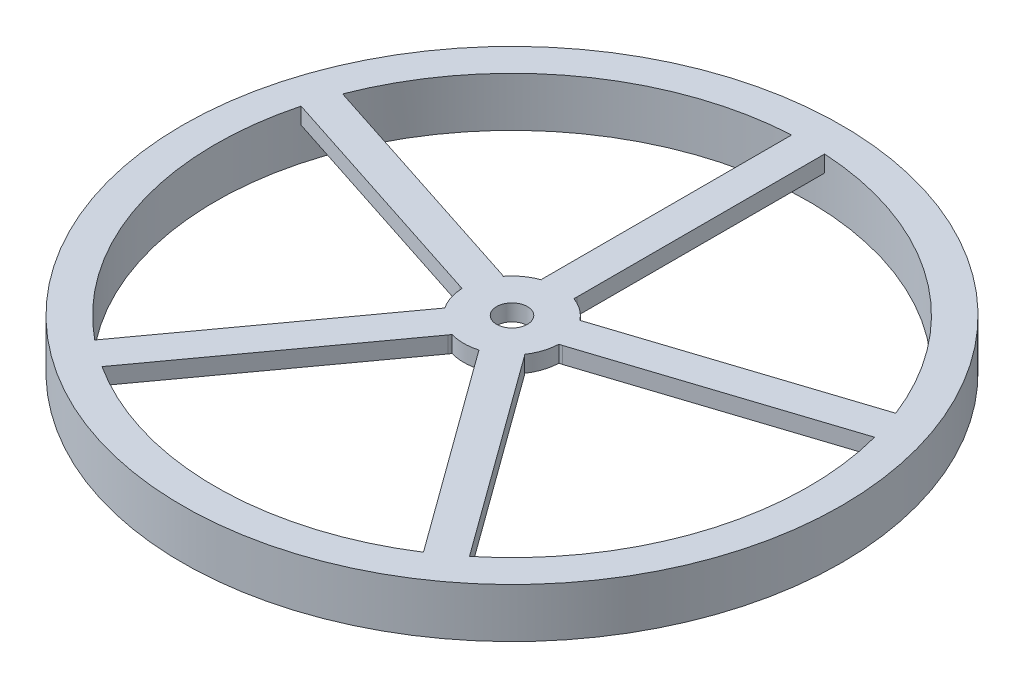
ISO-10303-21;
HEADER;
FILE_DESCRIPTION(('STEP AP214'),'2;1');
FILE_NAME('part.step','',(''),(''),'','','');
FILE_SCHEMA(('AUTOMOTIVE_DESIGN { 1 0 10303 214 1 1 1 1 }'));
ENDSEC;
DATA;
#1=APPLICATION_CONTEXT('core data for automotive mechanical design processes');
#2=APPLICATION_PROTOCOL_DEFINITION('international standard','automotive_design',2000,#1);
#3=PRODUCT_CONTEXT('',#1,'mechanical');
#4=PRODUCT('Part','Part','',(#3));
#5=PRODUCT_RELATED_PRODUCT_CATEGORY('part','',(#4));
#6=PRODUCT_DEFINITION_FORMATION('','',#4);
#7=PRODUCT_DEFINITION_CONTEXT('part definition',#1,'design');
#8=PRODUCT_DEFINITION('design','',#6,#7);
#9=PRODUCT_DEFINITION_SHAPE('','',#8);
#10=(LENGTH_UNIT() NAMED_UNIT(*) SI_UNIT(.MILLI.,.METRE.));
#11=(NAMED_UNIT(*) PLANE_ANGLE_UNIT() SI_UNIT($,.RADIAN.));
#12=(NAMED_UNIT(*) SI_UNIT($,.STERADIAN.) SOLID_ANGLE_UNIT());
#13=UNCERTAINTY_MEASURE_WITH_UNIT(LENGTH_MEASURE(1.E-05),#10,'distance_accuracy_value','');
#14=(GEOMETRIC_REPRESENTATION_CONTEXT(3) GLOBAL_UNCERTAINTY_ASSIGNED_CONTEXT((#13)) GLOBAL_UNIT_ASSIGNED_CONTEXT((#10,
#11,#12)) REPRESENTATION_CONTEXT('',''));
#15=CARTESIAN_POINT('',(0.,0.,0.));
#16=DIRECTION('',(0.,0.,1.));
#17=DIRECTION('',(1.,0.,0.));
#18=AXIS2_PLACEMENT_3D('',#15,#16,#17);
#19=CARTESIAN_POINT('',(0.,19.2418630451792,0.));
#20=DIRECTION('',(0.,1.,0.));
#21=DIRECTION('',(0.,0.,1.));
#22=AXIS2_PLACEMENT_3D('',#19,#20,#21);
#23=CYLINDRICAL_SURFACE('',#22,22.0125);
#24=DIRECTION('',(0.,1.,0.));
#25=VECTOR('',#24,1.);
#26=CARTESIAN_POINT('',(17.4362336668345,22.9918630451792,-13.4360675707421));
#27=LINE('',#26,#25);
#28=CARTESIAN_POINT('',(17.4362336668345,19.2418630451792,-13.4360675707421));
#29=VERTEX_POINT('',#28);
#30=CARTESIAN_POINT('',(17.4362336668345,26.7418630451792,-13.4360675707421));
#31=VERTEX_POINT('',#30);
#32=EDGE_CURVE('E296',#29,#31,#27,.T.);
#33=ORIENTED_EDGE('',*,*,#32,.F.);
#34=CARTESIAN_POINT('',(0.,19.2418630451792,0.));
#35=DIRECTION('',(0.,1.,0.));
#36=DIRECTION('',(1.,0.,0.));
#37=AXIS2_PLACEMENT_3D('',#34,#35,#36);
#38=CIRCLE('',#37,22.0125);
#39=CARTESIAN_POINT('',(7.39036709559162,19.2418630451792,-20.7348168654174));
#40=VERTEX_POINT('',#39);
#41=EDGE_CURVE('E422',#29,#40,#38,.T.);
#42=ORIENTED_EDGE('',*,*,#41,.T.);
#43=DIRECTION('',(0.,1.,0.));
#44=VECTOR('',#43,1.);
#45=CARTESIAN_POINT('',(7.39036709559161,22.9918630451792,-20.7348168654174));
#46=LINE('',#45,#44);
#47=CARTESIAN_POINT('',(7.39036709559161,26.7418630451792,-20.7348168654174));
#48=VERTEX_POINT('',#47);
#49=EDGE_CURVE('E491',#40,#48,#46,.T.);
#50=ORIENTED_EDGE('',*,*,#49,.T.);
#51=CARTESIAN_POINT('',(0.,26.7418630451792,0.));
#52=DIRECTION('',(0.,1.,0.));
#53=DIRECTION('',(1.,0.,0.));
#54=AXIS2_PLACEMENT_3D('',#51,#52,#53);
#55=CIRCLE('',#54,22.0125);
#56=EDGE_CURVE('E412',#31,#48,#55,.T.);
#57=ORIENTED_EDGE('',*,*,#56,.F.);
#58=EDGE_LOOP('',(#33,#42,#50,#57));
#59=FACE_BOUND('',#58,.T.);
#60=ADVANCED_FACE('F51',(#59),#23,.T.);
#61=DIRECTION('',(0.,1.,0.));
#62=VECTOR('',#61,1.);
#63=CARTESIAN_POINT('',(22.0037317212491,22.9918630451792,0.62124599740919));
#64=LINE('',#63,#62);
#65=CARTESIAN_POINT('',(22.0037317212491,26.7418630451792,0.62124599740919));
#66=VERTEX_POINT('',#65);
#67=CARTESIAN_POINT('',(22.0037317212491,19.2418630451792,0.62124599740919));
#68=VERTEX_POINT('',#67);
#69=EDGE_CURVE('E254',#66,#68,#64,.F.);
#70=ORIENTED_EDGE('',*,*,#69,.F.);
#71=CARTESIAN_POINT('',(18.1665521374807,26.7418630451792,12.4308704315585));
#72=VERTEX_POINT('',#71);
#73=EDGE_CURVE('E543',#72,#66,#55,.T.);
#74=ORIENTED_EDGE('',*,*,#73,.F.);
#75=DIRECTION('',(0.,1.,0.));
#76=VECTOR('',#75,1.);
#77=CARTESIAN_POINT('',(18.1665521374807,22.9918630451792,12.4308704315585));
#78=LINE('',#77,#76);
#79=CARTESIAN_POINT('',(18.1665521374807,19.2418630451792,12.4308704315585));
#80=VERTEX_POINT('',#79);
#81=EDGE_CURVE('E332',#80,#72,#78,.T.);
#82=ORIENTED_EDGE('',*,*,#81,.F.);
#83=EDGE_CURVE('E548',#80,#68,#38,.T.);
#84=ORIENTED_EDGE('',*,*,#83,.T.);
#85=EDGE_LOOP('',(#70,#74,#82,#84));
#86=FACE_BOUND('',#85,.T.);
#87=ADVANCED_FACE('F546',(#86),#23,.T.);
#88=DIRECTION('',(0.,1.,0.));
#89=VECTOR('',#88,1.);
#90=CARTESIAN_POINT('',(6.20868698747474,22.9918630451792,21.1187680071912));
#91=LINE('',#90,#89);
#92=CARTESIAN_POINT('',(6.20868698747474,26.7418630451792,21.1187680071912));
#93=VERTEX_POINT('',#92);
#94=CARTESIAN_POINT('',(6.20868698747474,19.2418630451792,21.1187680071912));
#95=VERTEX_POINT('',#94);
#96=EDGE_CURVE('E326',#93,#95,#91,.F.);
#97=ORIENTED_EDGE('',*,*,#96,.F.);
#98=CARTESIAN_POINT('',(-6.20868698747442,26.7418630451792,21.1187680071913));
#99=VERTEX_POINT('',#98);
#100=EDGE_CURVE('E591',#99,#93,#55,.T.);
#101=ORIENTED_EDGE('',*,*,#100,.F.);
#102=DIRECTION('',(0.,1.,0.));
#103=VECTOR('',#102,1.);
#104=CARTESIAN_POINT('',(-6.20868698747442,22.9918630451792,21.1187680071913));
#105=LINE('',#104,#103);
#106=CARTESIAN_POINT('',(-6.20868698747442,19.2418630451792,21.1187680071913));
#107=VERTEX_POINT('',#106);
#108=EDGE_CURVE('E369',#107,#99,#105,.T.);
#109=ORIENTED_EDGE('',*,*,#108,.F.);
#110=EDGE_CURVE('E551',#107,#95,#38,.T.);
#111=ORIENTED_EDGE('',*,*,#110,.T.);
#112=EDGE_LOOP('',(#97,#101,#109,#111));
#113=FACE_BOUND('',#112,.T.);
#114=ADVANCED_FACE('F631',(#113),#23,.T.);
#115=DIRECTION('',(0.,1.,0.));
#116=VECTOR('',#115,1.);
#117=CARTESIAN_POINT('',(-18.1665521374805,22.9918630451792,12.4308704315587));
#118=LINE('',#117,#116);
#119=CARTESIAN_POINT('',(-18.1665521374805,26.7418630451792,12.4308704315587));
#120=VERTEX_POINT('',#119);
#121=CARTESIAN_POINT('',(-18.1665521374805,19.2418630451792,12.4308704315587));
#122=VERTEX_POINT('',#121);
#123=EDGE_CURVE('E363',#120,#122,#118,.F.);
#124=ORIENTED_EDGE('',*,*,#123,.F.);
#125=CARTESIAN_POINT('',(-22.0037317212491,26.7418630451792,0.621245997409502));
#126=VERTEX_POINT('',#125);
#127=EDGE_CURVE('E427',#126,#120,#55,.T.);
#128=ORIENTED_EDGE('',*,*,#127,.F.);
#129=DIRECTION('',(0.,1.,0.));
#130=VECTOR('',#129,1.);
#131=CARTESIAN_POINT('',(-22.0037317212491,22.9918630451792,0.621245997409502));
#132=LINE('',#131,#130);
#133=CARTESIAN_POINT('',(-22.0037317212491,19.2418630451792,0.621245997409502));
#134=VERTEX_POINT('',#133);
#135=EDGE_CURVE('E498',#134,#126,#132,.T.);
#136=ORIENTED_EDGE('',*,*,#135,.F.);
#137=EDGE_CURVE('E421',#134,#122,#38,.T.);
#138=ORIENTED_EDGE('',*,*,#137,.T.);
#139=EDGE_LOOP('',(#124,#128,#136,#138));
#140=FACE_BOUND('',#139,.T.);
#141=ADVANCED_FACE('F574',(#140),#23,.T.);
#142=CARTESIAN_POINT('',(0.,19.2418630451792,-22.0125));
#143=DIRECTION('',(0.,1.,0.));
#144=DIRECTION('',(0.,0.,1.));
#145=AXIS2_PLACEMENT_3D('',#142,#143,#144);
#146=CYLINDRICAL_SURFACE('',#145,7.5);
#147=ORIENTED_EDGE('',*,*,#49,.F.);
#148=CARTESIAN_POINT('',(0.,19.2418630451792,-22.0125));
#149=DIRECTION('',(0.,1.,0.));
#150=DIRECTION('',(0.,0.,-1.));
#151=AXIS2_PLACEMENT_3D('',#148,#149,#150);
#152=CIRCLE('',#151,7.5);
#153=CARTESIAN_POINT('',(7.50000000000001,19.2418630451792,-22.0125));
#154=VERTEX_POINT('',#153);
#155=EDGE_CURVE('E433',#40,#154,#152,.T.);
#156=ORIENTED_EDGE('',*,*,#155,.T.);
#157=DIRECTION('',(0.,1.,0.));
#158=VECTOR('',#157,1.);
#159=CARTESIAN_POINT('',(7.50000000000001,19.2418630451792,-22.0125));
#160=LINE('',#159,#158);
#161=CARTESIAN_POINT('',(7.50000000000001,26.7418630451792,-22.0125));
#162=VERTEX_POINT('',#161);
#163=EDGE_CURVE('E440',#154,#162,#160,.T.);
#164=ORIENTED_EDGE('',*,*,#163,.T.);
#165=CARTESIAN_POINT('',(0.,26.7418630451792,-22.0125));
#166=DIRECTION('',(0.,1.,0.));
#167=DIRECTION('',(0.,0.,-1.));
#168=AXIS2_PLACEMENT_3D('',#165,#166,#167);
#169=CIRCLE('',#168,7.5);
#170=EDGE_CURVE('E420',#48,#162,#169,.T.);
#171=ORIENTED_EDGE('',*,*,#170,.F.);
#172=EDGE_LOOP('',(#147,#156,#164,#171));
#173=FACE_BOUND('',#172,.T.);
#174=ADVANCED_FACE('F563',(#173),#146,.T.);
#175=CARTESIAN_POINT('',(0.,26.7418630451792,0.));
#176=DIRECTION('',(0.,1.,0.));
#177=DIRECTION('',(0.,0.,1.));
#178=AXIS2_PLACEMENT_3D('',#175,#176,#177);
#179=PLANE('',#178);
#180=CARTESIAN_POINT('',(20.935131564947,26.7418630451792,-6.80223658867877));
#181=DIRECTION('',(0.,1.,0.));
#182=DIRECTION('',(0.95105651629515,0.,-0.309016994374958));
#183=AXIS2_PLACEMENT_3D('',#180,#181,#182);
#184=CIRCLE('',#183,7.5);
#185=CARTESIAN_POINT('',(18.6175041071348,26.7418630451792,-13.9351604608924));
#186=VERTEX_POINT('',#185);
#187=EDGE_CURVE('E67',#186,#31,#184,.T.);
#188=ORIENTED_EDGE('',*,*,#187,.T.);
#189=ORIENTED_EDGE('',*,*,#56,.T.);
#190=ORIENTED_EDGE('',*,*,#170,.T.);
#191=DIRECTION('',(0.,0.,-1.));
#192=VECTOR('',#191,1.);
#193=CARTESIAN_POINT('',(7.50000000000001,26.7418630451792,-22.0125));
#194=LINE('',#193,#192);
#195=CARTESIAN_POINT('',(7.50000000000001,26.7418630451792,-134.791505667086));
#196=VERTEX_POINT('',#195);
#197=EDGE_CURVE('E445',#162,#196,#194,.T.);
#198=ORIENTED_EDGE('',*,*,#197,.T.);
#199=CARTESIAN_POINT('',(0.,26.7418630451792,0.));
#200=DIRECTION('',(0.,1.,0.));
#201=DIRECTION('',(0.,0.,1.));
#202=AXIS2_PLACEMENT_3D('',#199,#200,#201);
#203=CIRCLE('',#202,135.);
#204=CARTESIAN_POINT('',(125.876712348104,26.7418630451792,-48.7857898207316));
#205=VERTEX_POINT('',#204);
#206=EDGE_CURVE('E465',#205,#196,#203,.T.);
#207=ORIENTED_EDGE('',*,*,#206,.F.);
#208=DIRECTION('',(-0.95105651629515,0.,0.309016994374958));
#209=VECTOR('',#208,1.);
#210=CARTESIAN_POINT('',(18.6175041071348,26.7418630451792,-13.9351604608924));
#211=LINE('',#210,#209);
#212=EDGE_CURVE('E261',#205,#186,#211,.T.);
#213=ORIENTED_EDGE('',*,*,#212,.T.);
#214=EDGE_LOOP('',(#188,#189,#190,#198,#207,#213));
#215=FACE_BOUND('',#214,.T.);
#216=ORIENTED_EDGE('',*,*,#73,.T.);
#217=CARTESIAN_POINT('',(23.2527590227592,26.7418630451792,0.330687283534859));
#218=VERTEX_POINT('',#217);
#219=EDGE_CURVE('E286',#66,#218,#184,.T.);
#220=ORIENTED_EDGE('',*,*,#219,.T.);
#221=DIRECTION('',(0.95105651629515,0.,-0.309016994374958));
#222=VECTOR('',#221,1.);
#223=CARTESIAN_POINT('',(23.2527590227592,26.7418630451792,0.330687283534859));
#224=LINE('',#223,#222);
#225=CARTESIAN_POINT('',(130.511967263729,26.7418630451792,-34.5199420763043));
#226=VERTEX_POINT('',#225);
#227=EDGE_CURVE('E268',#218,#226,#224,.T.);
#228=ORIENTED_EDGE('',*,*,#227,.T.);
#229=CARTESIAN_POINT('',(85.2960866232233,26.7418630451792,104.640229389865));
#230=VERTEX_POINT('',#229);
#231=EDGE_CURVE('E540',#230,#226,#203,.T.);
#232=ORIENTED_EDGE('',*,*,#231,.F.);
#233=DIRECTION('',(-0.58778525229248,0.,-0.809016994374942));
#234=VECTOR('',#233,1.);
#235=CARTESIAN_POINT('',(19.0062503239003,26.7418630451792,13.4000971964848));
#236=LINE('',#235,#234);
#237=CARTESIAN_POINT('',(19.0062503239003,26.7418630451792,13.4000971964848));
#238=VERTEX_POINT('',#237);
#239=EDGE_CURVE('E319',#230,#238,#236,.T.);
#240=ORIENTED_EDGE('',*,*,#239,.T.);
#241=CARTESIAN_POINT('',(12.9386228660882,26.7418630451792,17.8084865886784));
#242=DIRECTION('',(0.,1.,0.));
#243=DIRECTION('',(0.58778525229248,0.,0.809016994374942));
#244=AXIS2_PLACEMENT_3D('',#241,#242,#243);
#245=CIRCLE('',#244,7.5);
#246=EDGE_CURVE('E312',#238,#72,#245,.T.);
#247=ORIENTED_EDGE('',*,*,#246,.T.);
#248=EDGE_LOOP('',(#216,#220,#228,#232,#240,#247));
#249=FACE_BOUND('',#248,.T.);
#250=ORIENTED_EDGE('',*,*,#100,.T.);
#251=CARTESIAN_POINT('',(6.87099540827616,26.7418630451792,22.216875980872));
#252=VERTEX_POINT('',#251);
#253=EDGE_CURVE('E299',#93,#252,#245,.T.);
#254=ORIENTED_EDGE('',*,*,#253,.T.);
#255=DIRECTION('',(0.58778525229248,0.,0.809016994374942));
#256=VECTOR('',#255,1.);
#257=CARTESIAN_POINT('',(6.87099540827616,26.7418630451792,22.216875980872));
#258=LINE('',#257,#256);
#259=CARTESIAN_POINT('',(73.1608317075992,26.7418630451792,113.457008174252));
#260=VERTEX_POINT('',#259);
#261=EDGE_CURVE('E315',#252,#260,#258,.T.);
#262=ORIENTED_EDGE('',*,*,#261,.T.);
#263=CARTESIAN_POINT('',(-73.1608317075975,26.7418630451792,113.457008174253));
#264=VERTEX_POINT('',#263);
#265=EDGE_CURVE('E604',#264,#260,#203,.T.);
#266=ORIENTED_EDGE('',*,*,#265,.F.);
#267=DIRECTION('',(0.587785252292469,0.,-0.809016994374951));
#268=VECTOR('',#267,1.);
#269=CARTESIAN_POINT('',(-6.87099540827583,26.7418630451792,22.2168759808721));
#270=LINE('',#269,#268);
#271=CARTESIAN_POINT('',(-6.87099540827583,26.7418630451792,22.2168759808721));
#272=VERTEX_POINT('',#271);
#273=EDGE_CURVE('E356',#264,#272,#270,.T.);
#274=ORIENTED_EDGE('',*,*,#273,.T.);
#275=CARTESIAN_POINT('',(-12.938622866088,26.7418630451792,17.8084865886786));
#276=DIRECTION('',(0.,1.,0.));
#277=DIRECTION('',(-0.587785252292469,0.,0.809016994374951));
#278=AXIS2_PLACEMENT_3D('',#275,#276,#277);
#279=CIRCLE('',#278,7.5);
#280=EDGE_CURVE('E349',#272,#99,#279,.T.);
#281=ORIENTED_EDGE('',*,*,#280,.T.);
#282=EDGE_LOOP('',(#250,#254,#262,#266,#274,#281));
#283=FACE_BOUND('',#282,.T.);
#284=ORIENTED_EDGE('',*,*,#127,.T.);
#285=CARTESIAN_POINT('',(-19.0062503239001,26.7418630451792,13.4000971964851));
#286=VERTEX_POINT('',#285);
#287=EDGE_CURVE('E336',#120,#286,#279,.T.);
#288=ORIENTED_EDGE('',*,*,#287,.T.);
#289=DIRECTION('',(-0.587785252292469,0.,0.809016994374951));
#290=VECTOR('',#289,1.);
#291=CARTESIAN_POINT('',(-19.0062503239001,26.7418630451792,13.4000971964851));
#292=LINE('',#291,#290);
#293=CARTESIAN_POINT('',(-85.2960866232218,26.7418630451792,104.640229389866));
#294=VERTEX_POINT('',#293);
#295=EDGE_CURVE('E352',#286,#294,#292,.T.);
#296=ORIENTED_EDGE('',*,*,#295,.T.);
#297=CARTESIAN_POINT('',(-130.511967263729,26.7418630451792,-34.5199420763025));
#298=VERTEX_POINT('',#297);
#299=EDGE_CURVE('E464',#298,#294,#203,.T.);
#300=ORIENTED_EDGE('',*,*,#299,.F.);
#301=DIRECTION('',(0.951056516295155,0.,0.309016994374945));
#302=VECTOR('',#301,1.);
#303=CARTESIAN_POINT('',(-23.2527590227592,26.7418630451792,0.330687283535189));
#304=LINE('',#303,#302);
#305=CARTESIAN_POINT('',(-23.2527590227592,26.7418630451792,0.330687283535189));
#306=VERTEX_POINT('',#305);
#307=EDGE_CURVE('E393',#298,#306,#304,.T.);
#308=ORIENTED_EDGE('',*,*,#307,.T.);
#309=CARTESIAN_POINT('',(-20.9351315649471,26.7418630451792,-6.80223658867847));
#310=DIRECTION('',(0.,1.,0.));
#311=DIRECTION('',(-0.951056516295155,0.,-0.309016994374945));
#312=AXIS2_PLACEMENT_3D('',#309,#310,#311);
#313=CIRCLE('',#312,7.5);
#314=EDGE_CURVE('E386',#306,#126,#313,.T.);
#315=ORIENTED_EDGE('',*,*,#314,.T.);
#316=EDGE_LOOP('',(#284,#288,#296,#300,#308,#315));
#317=FACE_BOUND('',#316,.T.);
#318=CARTESIAN_POINT('',(-7.3903670955916,26.7418630451792,-20.7348168654174));
#319=VERTEX_POINT('',#318);
#320=CARTESIAN_POINT('',(-17.4362336668346,26.7418630451792,-13.4360675707419));
#321=VERTEX_POINT('',#320);
#322=EDGE_CURVE('E423',#319,#321,#55,.T.);
#323=ORIENTED_EDGE('',*,*,#322,.T.);
#324=CARTESIAN_POINT('',(-18.617504107135,26.7418630451792,-13.9351604608921));
#325=VERTEX_POINT('',#324);
#326=EDGE_CURVE('E373',#321,#325,#313,.T.);
#327=ORIENTED_EDGE('',*,*,#326,.T.);
#328=DIRECTION('',(-0.951056516295155,0.,-0.309016994374945));
#329=VECTOR('',#328,1.);
#330=CARTESIAN_POINT('',(-18.617504107135,26.7418630451792,-13.9351604608921));
#331=LINE('',#330,#329);
#332=CARTESIAN_POINT('',(-125.876712348105,26.7418630451792,-48.7857898207298));
#333=VERTEX_POINT('',#332);
#334=EDGE_CURVE('E389',#325,#333,#331,.T.);
#335=ORIENTED_EDGE('',*,*,#334,.T.);
#336=CARTESIAN_POINT('',(-7.49999999999999,26.7418630451792,-134.791505667086));
#337=VERTEX_POINT('',#336);
#338=EDGE_CURVE('E460',#337,#333,#203,.T.);
#339=ORIENTED_EDGE('',*,*,#338,.F.);
#340=DIRECTION('',(0.,0.,1.));
#341=VECTOR('',#340,1.);
#342=CARTESIAN_POINT('',(-7.49999999999999,26.7418630451792,-22.0125));
#343=LINE('',#342,#341);
#344=CARTESIAN_POINT('',(-7.49999999999999,26.7418630451792,-22.0125));
#345=VERTEX_POINT('',#344);
#346=EDGE_CURVE('E449',#337,#345,#343,.T.);
#347=ORIENTED_EDGE('',*,*,#346,.T.);
#348=EDGE_CURVE('E441',#345,#319,#169,.T.);
#349=ORIENTED_EDGE('',*,*,#348,.T.);
#350=EDGE_LOOP('',(#323,#327,#335,#339,#347,#349));
#351=FACE_BOUND('',#350,.T.);
#352=CARTESIAN_POINT('',(0.,26.7418630451792,0.));
#353=DIRECTION('',(0.,1.,0.));
#354=DIRECTION('',(1.,0.,0.));
#355=AXIS2_PLACEMENT_3D('',#352,#353,#354);
#356=CIRCLE('',#355,150.);
#357=CARTESIAN_POINT('',(150.,26.7418630451792,0.));
#358=VERTEX_POINT('',#357);
#359=EDGE_CURVE('E469',#358,#358,#356,.T.);
#360=ORIENTED_EDGE('',*,*,#359,.T.);
#361=EDGE_LOOP('',(#360));
#362=FACE_BOUND('',#361,.T.);
#363=CARTESIAN_POINT('',(0.,26.7418630451792,0.));
#364=DIRECTION('',(0.,1.,0.));
#365=DIRECTION('',(0.,0.,1.));
#366=AXIS2_PLACEMENT_3D('',#363,#364,#365);
#367=CIRCLE('',#366,7.0125);
#368=CARTESIAN_POINT('',(0.,26.7418630451792,7.0125));
#369=VERTEX_POINT('',#368);
#370=EDGE_CURVE('E407',#369,#369,#367,.T.);
#371=ORIENTED_EDGE('',*,*,#370,.F.);
#372=EDGE_LOOP('',(#371));
#373=FACE_BOUND('',#372,.T.);
#374=ADVANCED_FACE('F538',(#215,#249,#283,#317,#351,#362,#373),#179,.T.);
#375=CARTESIAN_POINT('',(0.,4.24186304517918,0.));
#376=DIRECTION('',(0.,1.,0.));
#377=DIRECTION('',(0.,0.,1.));
#378=AXIS2_PLACEMENT_3D('',#375,#376,#377);
#379=PLANE('',#378);
#380=CARTESIAN_POINT('',(0.,4.24186304517918,0.));
#381=DIRECTION('',(0.,1.,0.));
#382=DIRECTION('',(1.,0.,0.));
#383=AXIS2_PLACEMENT_3D('',#380,#381,#382);
#384=CIRCLE('',#383,150.);
#385=CARTESIAN_POINT('',(150.,4.24186304517918,0.));
#386=VERTEX_POINT('',#385);
#387=EDGE_CURVE('E463',#386,#386,#384,.T.);
#388=ORIENTED_EDGE('',*,*,#387,.F.);
#389=EDGE_LOOP('',(#388));
#390=FACE_BOUND('',#389,.T.);
#391=CARTESIAN_POINT('',(0.,4.24186304517918,0.));
#392=DIRECTION('',(0.,1.,0.));
#393=DIRECTION('',(0.,0.,1.));
#394=AXIS2_PLACEMENT_3D('',#391,#392,#393);
#395=CIRCLE('',#394,135.);
#396=CARTESIAN_POINT('',(0.,4.24186304517918,135.));
#397=VERTEX_POINT('',#396);
#398=EDGE_CURVE('E456',#397,#397,#395,.T.);
#399=ORIENTED_EDGE('',*,*,#398,.T.);
#400=EDGE_LOOP('',(#399));
#401=FACE_BOUND('',#400,.T.);
#402=ADVANCED_FACE('F885',(#390,#401),#379,.F.);
#403=CARTESIAN_POINT('',(0.,26.7418630451792,0.));
#404=DIRECTION('',(0.,-1.,0.));
#405=DIRECTION('',(0.,0.,-1.));
#406=AXIS2_PLACEMENT_3D('',#403,#404,#405);
#407=CYLINDRICAL_SURFACE('',#406,150.);
#408=ORIENTED_EDGE('',*,*,#359,.F.);
#409=EDGE_LOOP('',(#408));
#410=FACE_BOUND('',#409,.T.);
#411=ORIENTED_EDGE('',*,*,#387,.T.);
#412=EDGE_LOOP('',(#411));
#413=FACE_BOUND('',#412,.T.);
#414=ADVANCED_FACE('F53',(#410,#413),#407,.T.);
#415=CARTESIAN_POINT('',(0.,26.7418630451792,0.));
#416=DIRECTION('',(0.,-1.,0.));
#417=DIRECTION('',(0.,0.,-1.));
#418=AXIS2_PLACEMENT_3D('',#415,#416,#417);
#419=CYLINDRICAL_SURFACE('',#418,135.);
#420=DIRECTION('',(0.,-1.,0.));
#421=VECTOR('',#420,1.);
#422=CARTESIAN_POINT('',(125.876712348104,26.7418630451792,-48.7857898207316));
#423=LINE('',#422,#421);
#424=CARTESIAN_POINT('',(125.876712348104,19.2418630451792,-48.7857898207316));
#425=VERTEX_POINT('',#424);
#426=EDGE_CURVE('E12',#205,#425,#423,.T.);
#427=ORIENTED_EDGE('',*,*,#426,.F.);
#428=ORIENTED_EDGE('',*,*,#206,.T.);
#429=DIRECTION('',(0.,-1.,0.));
#430=VECTOR('',#429,1.);
#431=CARTESIAN_POINT('',(7.50000000000001,26.7418630451792,-134.791505667086));
#432=LINE('',#431,#430);
#433=CARTESIAN_POINT('',(7.50000000000001,19.2418630451792,-134.791505667086));
#434=VERTEX_POINT('',#433);
#435=EDGE_CURVE('E480',#434,#196,#432,.F.);
#436=ORIENTED_EDGE('',*,*,#435,.F.);
#437=CARTESIAN_POINT('',(0.,19.2418630451792,0.));
#438=DIRECTION('',(0.,-1.,0.));
#439=DIRECTION('',(0.,0.,-1.));
#440=AXIS2_PLACEMENT_3D('',#437,#438,#439);
#441=CIRCLE('',#440,135.);
#442=CARTESIAN_POINT('',(-7.49999999999999,19.2418630451792,-134.791505667086));
#443=VERTEX_POINT('',#442);
#444=EDGE_CURVE('E473',#443,#434,#441,.T.);
#445=ORIENTED_EDGE('',*,*,#444,.F.);
#446=DIRECTION('',(0.,-1.,0.));
#447=VECTOR('',#446,1.);
#448=CARTESIAN_POINT('',(-7.49999999999999,26.7418630451792,-134.791505667086));
#449=LINE('',#448,#447);
#450=EDGE_CURVE('E484',#337,#443,#449,.T.);
#451=ORIENTED_EDGE('',*,*,#450,.F.);
#452=ORIENTED_EDGE('',*,*,#338,.T.);
#453=DIRECTION('',(0.,-1.,0.));
#454=VECTOR('',#453,1.);
#455=CARTESIAN_POINT('',(-125.876712348105,26.7418630451792,-48.7857898207298));
#456=LINE('',#455,#454);
#457=CARTESIAN_POINT('',(-125.876712348105,19.2418630451792,-48.7857898207298));
#458=VERTEX_POINT('',#457);
#459=EDGE_CURVE('E502',#458,#333,#456,.F.);
#460=ORIENTED_EDGE('',*,*,#459,.F.);
#461=CARTESIAN_POINT('',(0.,19.2418630451792,0.));
#462=DIRECTION('',(0.,-1.,0.));
#463=DIRECTION('',(0.,0.,-1.));
#464=AXIS2_PLACEMENT_3D('',#461,#462,#463);
#465=CIRCLE('',#464,135.);
#466=CARTESIAN_POINT('',(-130.511967263729,19.2418630451792,-34.5199420763025));
#467=VERTEX_POINT('',#466);
#468=EDGE_CURVE('E400',#467,#458,#465,.T.);
#469=ORIENTED_EDGE('',*,*,#468,.F.);
#470=DIRECTION('',(0.,-1.,0.));
#471=VECTOR('',#470,1.);
#472=CARTESIAN_POINT('',(-130.511967263729,26.7418630451792,-34.5199420763025));
#473=LINE('',#472,#471);
#474=EDGE_CURVE('E506',#298,#467,#473,.T.);
#475=ORIENTED_EDGE('',*,*,#474,.F.);
#476=ORIENTED_EDGE('',*,*,#299,.T.);
#477=DIRECTION('',(0.,-1.,0.));
#478=VECTOR('',#477,1.);
#479=CARTESIAN_POINT('',(-85.2960866232218,26.7418630451792,104.640229389866));
#480=LINE('',#479,#478);
#481=CARTESIAN_POINT('',(-85.2960866232218,19.2418630451792,104.640229389866));
#482=VERTEX_POINT('',#481);
#483=EDGE_CURVE('E514',#482,#294,#480,.F.);
#484=ORIENTED_EDGE('',*,*,#483,.F.);
#485=CARTESIAN_POINT('',(0.,19.2418630451792,0.));
#486=DIRECTION('',(0.,-1.,0.));
#487=DIRECTION('',(0.,0.,-1.));
#488=AXIS2_PLACEMENT_3D('',#485,#486,#487);
#489=CIRCLE('',#488,135.);
#490=CARTESIAN_POINT('',(-73.1608317075975,19.2418630451792,113.457008174253));
#491=VERTEX_POINT('',#490);
#492=EDGE_CURVE('E510',#491,#482,#489,.T.);
#493=ORIENTED_EDGE('',*,*,#492,.F.);
#494=DIRECTION('',(0.,-1.,0.));
#495=VECTOR('',#494,1.);
#496=CARTESIAN_POINT('',(-73.1608317075975,26.7418630451792,113.457008174253));
#497=LINE('',#496,#495);
#498=EDGE_CURVE('E518',#264,#491,#497,.T.);
#499=ORIENTED_EDGE('',*,*,#498,.F.);
#500=ORIENTED_EDGE('',*,*,#265,.T.);
#501=DIRECTION('',(0.,-1.,0.));
#502=VECTOR('',#501,1.);
#503=CARTESIAN_POINT('',(73.1608317075992,26.7418630451792,113.457008174252));
#504=LINE('',#503,#502);
#505=CARTESIAN_POINT('',(73.1608317075992,19.2418630451792,113.457008174252));
#506=VERTEX_POINT('',#505);
#507=EDGE_CURVE('E526',#506,#260,#504,.F.);
#508=ORIENTED_EDGE('',*,*,#507,.F.);
#509=CARTESIAN_POINT('',(0.,19.2418630451792,0.));
#510=DIRECTION('',(0.,-1.,0.));
#511=DIRECTION('',(0.,0.,-1.));
#512=AXIS2_PLACEMENT_3D('',#509,#510,#511);
#513=CIRCLE('',#512,135.);
#514=CARTESIAN_POINT('',(85.2960866232233,19.2418630451792,104.640229389865));
#515=VERTEX_POINT('',#514);
#516=EDGE_CURVE('E522',#515,#506,#513,.T.);
#517=ORIENTED_EDGE('',*,*,#516,.F.);
#518=DIRECTION('',(0.,-1.,0.));
#519=VECTOR('',#518,1.);
#520=CARTESIAN_POINT('',(85.2960866232233,26.7418630451792,104.640229389865));
#521=LINE('',#520,#519);
#522=EDGE_CURVE('E530',#230,#515,#521,.T.);
#523=ORIENTED_EDGE('',*,*,#522,.F.);
#524=ORIENTED_EDGE('',*,*,#231,.T.);
#525=DIRECTION('',(0.,-1.,0.));
#526=VECTOR('',#525,1.);
#527=CARTESIAN_POINT('',(130.511967263729,26.7418630451792,-34.5199420763043));
#528=LINE('',#527,#526);
#529=CARTESIAN_POINT('',(130.511967263729,19.2418630451792,-34.5199420763043));
#530=VERTEX_POINT('',#529);
#531=EDGE_CURVE('E60',#530,#226,#528,.F.);
#532=ORIENTED_EDGE('',*,*,#531,.F.);
#533=CARTESIAN_POINT('',(0.,19.2418630451792,0.));
#534=DIRECTION('',(0.,-1.,0.));
#535=DIRECTION('',(0.,0.,-1.));
#536=AXIS2_PLACEMENT_3D('',#533,#534,#535);
#537=CIRCLE('',#536,135.);
#538=EDGE_CURVE('E277',#425,#530,#537,.T.);
#539=ORIENTED_EDGE('',*,*,#538,.F.);
#540=EDGE_LOOP('',(#427,#428,#436,#445,#451,#452,#460,#469,#475,#476,#484,#493,#499,#500,#508,
#517,#523,#524,#532,#539));
#541=FACE_BOUND('',#540,.T.);
#542=ORIENTED_EDGE('',*,*,#398,.F.);
#543=EDGE_LOOP('',(#542));
#544=FACE_BOUND('',#543,.T.);
#545=ADVANCED_FACE('F601',(#541,#544),#419,.F.);
#546=CARTESIAN_POINT('',(0.,19.2418630451792,-22.0125));
#547=DIRECTION('',(0.,-1.,0.));
#548=DIRECTION('',(0.,0.,-1.));
#549=AXIS2_PLACEMENT_3D('',#546,#547,#548);
#550=PLANE('',#549);
#551=ORIENTED_EDGE('',*,*,#41,.F.);
#552=CARTESIAN_POINT('',(20.935131564947,19.2418630451792,-6.80223658867877));
#553=DIRECTION('',(0.,1.,0.));
#554=DIRECTION('',(0.95105651629515,0.,-0.309016994374958));
#555=AXIS2_PLACEMENT_3D('',#552,#553,#554);
#556=CIRCLE('',#555,7.5);
#557=CARTESIAN_POINT('',(18.6175041071348,19.2418630451792,-13.9351604608924));
#558=VERTEX_POINT('',#557);
#559=EDGE_CURVE('E260',#558,#29,#556,.T.);
#560=ORIENTED_EDGE('',*,*,#559,.F.);
#561=DIRECTION('',(-0.95105651629515,0.,0.309016994374958));
#562=VECTOR('',#561,1.);
#563=CARTESIAN_POINT('',(18.6175041071348,19.2418630451792,-13.9351604608924));
#564=LINE('',#563,#562);
#565=EDGE_CURVE('E271',#425,#558,#564,.T.);
#566=ORIENTED_EDGE('',*,*,#565,.F.);
#567=ORIENTED_EDGE('',*,*,#538,.T.);
#568=DIRECTION('',(0.95105651629515,0.,-0.309016994374958));
#569=VECTOR('',#568,1.);
#570=CARTESIAN_POINT('',(23.2527590227592,19.2418630451792,0.330687283534859));
#571=LINE('',#570,#569);
#572=CARTESIAN_POINT('',(23.2527590227592,19.2418630451792,0.330687283534859));
#573=VERTEX_POINT('',#572);
#574=EDGE_CURVE('E266',#573,#530,#571,.T.);
#575=ORIENTED_EDGE('',*,*,#574,.F.);
#576=EDGE_CURVE('E248',#68,#573,#556,.T.);
#577=ORIENTED_EDGE('',*,*,#576,.F.);
#578=ORIENTED_EDGE('',*,*,#83,.F.);
#579=CARTESIAN_POINT('',(12.9386228660882,19.2418630451792,17.8084865886784));
#580=DIRECTION('',(0.,1.,0.));
#581=DIRECTION('',(0.58778525229248,0.,0.809016994374942));
#582=AXIS2_PLACEMENT_3D('',#579,#580,#581);
#583=CIRCLE('',#582,7.5);
#584=CARTESIAN_POINT('',(19.0062503239003,19.2418630451792,13.4000971964848));
#585=VERTEX_POINT('',#584);
#586=EDGE_CURVE('E300',#585,#80,#583,.T.);
#587=ORIENTED_EDGE('',*,*,#586,.F.);
#588=DIRECTION('',(-0.58778525229248,0.,-0.809016994374942));
#589=VECTOR('',#588,1.);
#590=CARTESIAN_POINT('',(19.0062503239003,19.2418630451792,13.4000971964848));
#591=LINE('',#590,#589);
#592=EDGE_CURVE('E308',#515,#585,#591,.T.);
#593=ORIENTED_EDGE('',*,*,#592,.F.);
#594=ORIENTED_EDGE('',*,*,#516,.T.);
#595=DIRECTION('',(0.58778525229248,0.,0.809016994374942));
#596=VECTOR('',#595,1.);
#597=CARTESIAN_POINT('',(6.87099540827616,19.2418630451792,22.216875980872));
#598=LINE('',#597,#596);
#599=CARTESIAN_POINT('',(6.87099540827616,19.2418630451792,22.216875980872));
#600=VERTEX_POINT('',#599);
#601=EDGE_CURVE('E303',#600,#506,#598,.T.);
#602=ORIENTED_EDGE('',*,*,#601,.F.);
#603=EDGE_CURVE('E304',#95,#600,#583,.T.);
#604=ORIENTED_EDGE('',*,*,#603,.F.);
#605=ORIENTED_EDGE('',*,*,#110,.F.);
#606=CARTESIAN_POINT('',(-12.938622866088,19.2418630451792,17.8084865886786));
#607=DIRECTION('',(0.,1.,0.));
#608=DIRECTION('',(-0.587785252292469,0.,0.809016994374951));
#609=AXIS2_PLACEMENT_3D('',#606,#607,#608);
#610=CIRCLE('',#609,7.5);
#611=CARTESIAN_POINT('',(-6.87099540827583,19.2418630451792,22.2168759808721));
#612=VERTEX_POINT('',#611);
#613=EDGE_CURVE('E337',#612,#107,#610,.T.);
#614=ORIENTED_EDGE('',*,*,#613,.F.);
#615=DIRECTION('',(0.587785252292469,0.,-0.809016994374951));
#616=VECTOR('',#615,1.);
#617=CARTESIAN_POINT('',(-6.87099540827583,19.2418630451792,22.2168759808721));
#618=LINE('',#617,#616);
#619=EDGE_CURVE('E345',#491,#612,#618,.T.);
#620=ORIENTED_EDGE('',*,*,#619,.F.);
#621=ORIENTED_EDGE('',*,*,#492,.T.);
#622=DIRECTION('',(-0.587785252292469,0.,0.809016994374951));
#623=VECTOR('',#622,1.);
#624=CARTESIAN_POINT('',(-19.0062503239001,19.2418630451792,13.4000971964851));
#625=LINE('',#624,#623);
#626=CARTESIAN_POINT('',(-19.0062503239001,19.2418630451792,13.4000971964851));
#627=VERTEX_POINT('',#626);
#628=EDGE_CURVE('E340',#627,#482,#625,.T.);
#629=ORIENTED_EDGE('',*,*,#628,.F.);
#630=EDGE_CURVE('E341',#122,#627,#610,.T.);
#631=ORIENTED_EDGE('',*,*,#630,.F.);
#632=ORIENTED_EDGE('',*,*,#137,.F.);
#633=CARTESIAN_POINT('',(-20.9351315649471,19.2418630451792,-6.80223658867847));
#634=DIRECTION('',(0.,1.,0.));
#635=DIRECTION('',(-0.951056516295155,0.,-0.309016994374945));
#636=AXIS2_PLACEMENT_3D('',#633,#634,#635);
#637=CIRCLE('',#636,7.5);
#638=CARTESIAN_POINT('',(-23.2527590227592,19.2418630451792,0.330687283535189));
#639=VERTEX_POINT('',#638);
#640=EDGE_CURVE('E374',#639,#134,#637,.T.);
#641=ORIENTED_EDGE('',*,*,#640,.F.);
#642=DIRECTION('',(0.951056516295155,0.,0.309016994374945));
#643=VECTOR('',#642,1.);
#644=CARTESIAN_POINT('',(-23.2527590227592,19.2418630451792,0.330687283535189));
#645=LINE('',#644,#643);
#646=EDGE_CURVE('E382',#467,#639,#645,.T.);
#647=ORIENTED_EDGE('',*,*,#646,.F.);
#648=ORIENTED_EDGE('',*,*,#468,.T.);
#649=DIRECTION('',(-0.951056516295155,0.,-0.309016994374945));
#650=VECTOR('',#649,1.);
#651=CARTESIAN_POINT('',(-18.617504107135,19.2418630451792,-13.9351604608921));
#652=LINE('',#651,#650);
#653=CARTESIAN_POINT('',(-18.617504107135,19.2418630451792,-13.9351604608921));
#654=VERTEX_POINT('',#653);
#655=EDGE_CURVE('E377',#654,#458,#652,.T.);
#656=ORIENTED_EDGE('',*,*,#655,.F.);
#657=CARTESIAN_POINT('',(-17.4362336668346,19.2418630451792,-13.4360675707419));
#658=VERTEX_POINT('',#657);
#659=EDGE_CURVE('E378',#658,#654,#637,.T.);
#660=ORIENTED_EDGE('',*,*,#659,.F.);
#661=CARTESIAN_POINT('',(-7.3903670955916,19.2418630451792,-20.7348168654174));
#662=VERTEX_POINT('',#661);
#663=EDGE_CURVE('E416',#662,#658,#38,.T.);
#664=ORIENTED_EDGE('',*,*,#663,.F.);
#665=CARTESIAN_POINT('',(-7.49999999999999,19.2418630451792,-22.0125));
#666=VERTEX_POINT('',#665);
#667=EDGE_CURVE('E428',#666,#662,#152,.T.);
#668=ORIENTED_EDGE('',*,*,#667,.F.);
#669=DIRECTION('',(0.,0.,1.));
#670=VECTOR('',#669,1.);
#671=CARTESIAN_POINT('',(-7.49999999999999,19.2418630451792,-22.0125));
#672=LINE('',#671,#670);
#673=EDGE_CURVE('E437',#443,#666,#672,.T.);
#674=ORIENTED_EDGE('',*,*,#673,.F.);
#675=ORIENTED_EDGE('',*,*,#444,.T.);
#676=DIRECTION('',(0.,0.,-1.));
#677=VECTOR('',#676,1.);
#678=CARTESIAN_POINT('',(7.50000000000001,19.2418630451792,-22.0125));
#679=LINE('',#678,#677);
#680=EDGE_CURVE('E432',#154,#434,#679,.T.);
#681=ORIENTED_EDGE('',*,*,#680,.F.);
#682=ORIENTED_EDGE('',*,*,#155,.F.);
#683=EDGE_LOOP('',(#551,#560,#566,#567,#575,#577,#578,#587,#593,#594,#602,#604,#605,#614,#620,
#621,#629,#631,#632,#641,#647,#648,#656,#660,#664,#668,#674,#675,#681,#682));
#684=FACE_BOUND('',#683,.T.);
#685=CARTESIAN_POINT('',(0.,19.2418630451792,0.));
#686=DIRECTION('',(0.,1.,0.));
#687=DIRECTION('',(0.,0.,1.));
#688=AXIS2_PLACEMENT_3D('',#685,#686,#687);
#689=CIRCLE('',#688,7.0125);
#690=CARTESIAN_POINT('',(0.,19.2418630451792,7.0125));
#691=VERTEX_POINT('',#690);
#692=EDGE_CURVE('E408',#691,#691,#689,.T.);
#693=ORIENTED_EDGE('',*,*,#692,.T.);
#694=EDGE_LOOP('',(#693));
#695=FACE_BOUND('',#694,.T.);
#696=ADVANCED_FACE('F274',(#684,#695),#550,.T.);
#697=DIRECTION('',(0.,1.,0.));
#698=VECTOR('',#697,1.);
#699=CARTESIAN_POINT('',(-7.3903670955916,22.9918630451792,-20.7348168654174));
#700=LINE('',#699,#698);
#701=EDGE_CURVE('E488',#319,#662,#700,.F.);
#702=ORIENTED_EDGE('',*,*,#701,.F.);
#703=ORIENTED_EDGE('',*,*,#348,.F.);
#704=DIRECTION('',(0.,1.,0.));
#705=VECTOR('',#704,1.);
#706=CARTESIAN_POINT('',(-7.49999999999999,19.2418630451792,-22.0125));
#707=LINE('',#706,#705);
#708=EDGE_CURVE('E452',#666,#345,#707,.T.);
#709=ORIENTED_EDGE('',*,*,#708,.F.);
#710=ORIENTED_EDGE('',*,*,#667,.T.);
#711=EDGE_LOOP('',(#702,#703,#709,#710));
#712=FACE_BOUND('',#711,.T.);
#713=ADVANCED_FACE('F654',(#712),#146,.T.);
#714=CARTESIAN_POINT('',(-7.49999999999999,19.2418630451792,-22.0125));
#715=DIRECTION('',(-1.,0.,0.));
#716=DIRECTION('',(0.,0.,1.));
#717=AXIS2_PLACEMENT_3D('',#714,#715,#716);
#718=PLANE('',#717);
#719=ORIENTED_EDGE('',*,*,#346,.F.);
#720=ORIENTED_EDGE('',*,*,#450,.T.);
#721=ORIENTED_EDGE('',*,*,#673,.T.);
#722=ORIENTED_EDGE('',*,*,#708,.T.);
#723=EDGE_LOOP('',(#719,#720,#721,#722));
#724=FACE_BOUND('',#723,.T.);
#725=ADVANCED_FACE('F644',(#724),#718,.T.);
#726=CARTESIAN_POINT('',(7.50000000000001,19.2418630451792,-22.0125));
#727=DIRECTION('',(1.,0.,0.));
#728=DIRECTION('',(0.,0.,-1.));
#729=AXIS2_PLACEMENT_3D('',#726,#727,#728);
#730=PLANE('',#729);
#731=ORIENTED_EDGE('',*,*,#680,.T.);
#732=ORIENTED_EDGE('',*,*,#435,.T.);
#733=ORIENTED_EDGE('',*,*,#197,.F.);
#734=ORIENTED_EDGE('',*,*,#163,.F.);
#735=EDGE_LOOP('',(#731,#732,#733,#734));
#736=FACE_BOUND('',#735,.T.);
#737=ADVANCED_FACE('F636',(#736),#730,.T.);
#738=DIRECTION('',(0.,1.,0.));
#739=VECTOR('',#738,1.);
#740=CARTESIAN_POINT('',(-17.4362336668346,22.9918630451792,-13.4360675707419));
#741=LINE('',#740,#739);
#742=EDGE_CURVE('E495',#321,#658,#741,.F.);
#743=ORIENTED_EDGE('',*,*,#742,.F.);
#744=ORIENTED_EDGE('',*,*,#322,.F.);
#745=ORIENTED_EDGE('',*,*,#701,.T.);
#746=ORIENTED_EDGE('',*,*,#663,.T.);
#747=EDGE_LOOP('',(#743,#744,#745,#746));
#748=FACE_BOUND('',#747,.T.);
#749=ADVANCED_FACE('F627',(#748),#23,.T.);
#750=CARTESIAN_POINT('',(0.,19.2418630451792,0.));
#751=DIRECTION('',(0.,1.,0.));
#752=DIRECTION('',(0.,0.,1.));
#753=AXIS2_PLACEMENT_3D('',#750,#751,#752);
#754=CYLINDRICAL_SURFACE('',#753,7.0125);
#755=ORIENTED_EDGE('',*,*,#692,.F.);
#756=EDGE_LOOP('',(#755));
#757=FACE_BOUND('',#756,.T.);
#758=ORIENTED_EDGE('',*,*,#370,.T.);
#759=EDGE_LOOP('',(#758));
#760=FACE_BOUND('',#759,.T.);
#761=ADVANCED_FACE('F635',(#757,#760),#754,.F.);
#762=CARTESIAN_POINT('',(-20.9351315649471,19.2418630451792,-6.80223658867847));
#763=DIRECTION('',(0.,1.,0.));
#764=DIRECTION('',(0.,0.,1.));
#765=AXIS2_PLACEMENT_3D('',#762,#763,#764);
#766=CYLINDRICAL_SURFACE('',#765,7.5);
#767=ORIENTED_EDGE('',*,*,#640,.T.);
#768=ORIENTED_EDGE('',*,*,#135,.T.);
#769=ORIENTED_EDGE('',*,*,#314,.F.);
#770=DIRECTION('',(0.,1.,0.));
#771=VECTOR('',#770,1.);
#772=CARTESIAN_POINT('',(-23.2527590227592,19.2418630451792,0.330687283535189));
#773=LINE('',#772,#771);
#774=EDGE_CURVE('E396',#639,#306,#773,.T.);
#775=ORIENTED_EDGE('',*,*,#774,.F.);
#776=EDGE_LOOP('',(#767,#768,#769,#775));
#777=FACE_BOUND('',#776,.T.);
#778=ADVANCED_FACE('F642',(#777),#766,.T.);
#779=ORIENTED_EDGE('',*,*,#326,.F.);
#780=ORIENTED_EDGE('',*,*,#742,.T.);
#781=ORIENTED_EDGE('',*,*,#659,.T.);
#782=DIRECTION('',(0.,1.,0.));
#783=VECTOR('',#782,1.);
#784=CARTESIAN_POINT('',(-18.617504107135,19.2418630451792,-13.9351604608921));
#785=LINE('',#784,#783);
#786=EDGE_CURVE('E385',#654,#325,#785,.T.);
#787=ORIENTED_EDGE('',*,*,#786,.T.);
#788=EDGE_LOOP('',(#779,#780,#781,#787));
#789=FACE_BOUND('',#788,.T.);
#790=ADVANCED_FACE('F705',(#789),#766,.T.);
#791=CARTESIAN_POINT('',(-23.2527590227592,19.2418630451792,0.330687283535189));
#792=DIRECTION('',(-0.309016994374945,0.,0.951056516295155));
#793=DIRECTION('',(0.951056516295155,0.,0.309016994374945));
#794=AXIS2_PLACEMENT_3D('',#791,#792,#793);
#795=PLANE('',#794);
#796=ORIENTED_EDGE('',*,*,#307,.F.);
#797=ORIENTED_EDGE('',*,*,#474,.T.);
#798=ORIENTED_EDGE('',*,*,#646,.T.);
#799=ORIENTED_EDGE('',*,*,#774,.T.);
#800=EDGE_LOOP('',(#796,#797,#798,#799));
#801=FACE_BOUND('',#800,.T.);
#802=ADVANCED_FACE('F697',(#801),#795,.T.);
#803=CARTESIAN_POINT('',(-18.617504107135,19.2418630451792,-13.9351604608921));
#804=DIRECTION('',(0.309016994374945,0.,-0.951056516295155));
#805=DIRECTION('',(-0.951056516295155,0.,-0.309016994374945));
#806=AXIS2_PLACEMENT_3D('',#803,#804,#805);
#807=PLANE('',#806);
#808=ORIENTED_EDGE('',*,*,#655,.T.);
#809=ORIENTED_EDGE('',*,*,#459,.T.);
#810=ORIENTED_EDGE('',*,*,#334,.F.);
#811=ORIENTED_EDGE('',*,*,#786,.F.);
#812=EDGE_LOOP('',(#808,#809,#810,#811));
#813=FACE_BOUND('',#812,.T.);
#814=ADVANCED_FACE('F690',(#813),#807,.T.);
#815=CARTESIAN_POINT('',(-12.938622866088,19.2418630451792,17.8084865886786));
#816=DIRECTION('',(0.,1.,0.));
#817=DIRECTION('',(0.,0.,1.));
#818=AXIS2_PLACEMENT_3D('',#815,#816,#817);
#819=CYLINDRICAL_SURFACE('',#818,7.5);
#820=ORIENTED_EDGE('',*,*,#613,.T.);
#821=ORIENTED_EDGE('',*,*,#108,.T.);
#822=ORIENTED_EDGE('',*,*,#280,.F.);
#823=DIRECTION('',(0.,1.,0.));
#824=VECTOR('',#823,1.);
#825=CARTESIAN_POINT('',(-6.87099540827583,19.2418630451792,22.2168759808721));
#826=LINE('',#825,#824);
#827=EDGE_CURVE('E359',#612,#272,#826,.T.);
#828=ORIENTED_EDGE('',*,*,#827,.F.);
#829=EDGE_LOOP('',(#820,#821,#822,#828));
#830=FACE_BOUND('',#829,.T.);
#831=ADVANCED_FACE('F664',(#830),#819,.T.);
#832=ORIENTED_EDGE('',*,*,#287,.F.);
#833=ORIENTED_EDGE('',*,*,#123,.T.);
#834=ORIENTED_EDGE('',*,*,#630,.T.);
#835=DIRECTION('',(0.,1.,0.));
#836=VECTOR('',#835,1.);
#837=CARTESIAN_POINT('',(-19.0062503239001,19.2418630451792,13.4000971964851));
#838=LINE('',#837,#836);
#839=EDGE_CURVE('E348',#627,#286,#838,.T.);
#840=ORIENTED_EDGE('',*,*,#839,.T.);
#841=EDGE_LOOP('',(#832,#833,#834,#840));
#842=FACE_BOUND('',#841,.T.);
#843=ADVANCED_FACE('F669',(#842),#819,.T.);
#844=CARTESIAN_POINT('',(-6.87099540827583,19.2418630451792,22.2168759808721));
#845=DIRECTION('',(0.809016994374951,0.,0.587785252292469));
#846=DIRECTION('',(0.587785252292469,0.,-0.809016994374951));
#847=AXIS2_PLACEMENT_3D('',#844,#845,#846);
#848=PLANE('',#847);
#849=ORIENTED_EDGE('',*,*,#273,.F.);
#850=ORIENTED_EDGE('',*,*,#498,.T.);
#851=ORIENTED_EDGE('',*,*,#619,.T.);
#852=ORIENTED_EDGE('',*,*,#827,.T.);
#853=EDGE_LOOP('',(#849,#850,#851,#852));
#854=FACE_BOUND('',#853,.T.);
#855=ADVANCED_FACE('F620',(#854),#848,.T.);
#856=CARTESIAN_POINT('',(-19.0062503239001,19.2418630451792,13.4000971964851));
#857=DIRECTION('',(-0.809016994374951,0.,-0.587785252292469));
#858=DIRECTION('',(-0.587785252292469,0.,0.809016994374951));
#859=AXIS2_PLACEMENT_3D('',#856,#857,#858);
#860=PLANE('',#859);
#861=ORIENTED_EDGE('',*,*,#628,.T.);
#862=ORIENTED_EDGE('',*,*,#483,.T.);
#863=ORIENTED_EDGE('',*,*,#295,.F.);
#864=ORIENTED_EDGE('',*,*,#839,.F.);
#865=EDGE_LOOP('',(#861,#862,#863,#864));
#866=FACE_BOUND('',#865,.T.);
#867=ADVANCED_FACE('F614',(#866),#860,.T.);
#868=CARTESIAN_POINT('',(12.9386228660882,19.2418630451792,17.8084865886784));
#869=DIRECTION('',(0.,1.,0.));
#870=DIRECTION('',(0.,0.,1.));
#871=AXIS2_PLACEMENT_3D('',#868,#869,#870);
#872=CYLINDRICAL_SURFACE('',#871,7.5);
#873=ORIENTED_EDGE('',*,*,#586,.T.);
#874=ORIENTED_EDGE('',*,*,#81,.T.);
#875=ORIENTED_EDGE('',*,*,#246,.F.);
#876=DIRECTION('',(0.,1.,0.));
#877=VECTOR('',#876,1.);
#878=CARTESIAN_POINT('',(19.0062503239003,19.2418630451792,13.4000971964848));
#879=LINE('',#878,#877);
#880=EDGE_CURVE('E322',#585,#238,#879,.T.);
#881=ORIENTED_EDGE('',*,*,#880,.F.);
#882=EDGE_LOOP('',(#873,#874,#875,#881));
#883=FACE_BOUND('',#882,.T.);
#884=ADVANCED_FACE('F612',(#883),#872,.T.);
#885=ORIENTED_EDGE('',*,*,#253,.F.);
#886=ORIENTED_EDGE('',*,*,#96,.T.);
#887=ORIENTED_EDGE('',*,*,#603,.T.);
#888=DIRECTION('',(0.,1.,0.));
#889=VECTOR('',#888,1.);
#890=CARTESIAN_POINT('',(6.87099540827616,19.2418630451792,22.216875980872));
#891=LINE('',#890,#889);
#892=EDGE_CURVE('E311',#600,#252,#891,.T.);
#893=ORIENTED_EDGE('',*,*,#892,.T.);
#894=EDGE_LOOP('',(#885,#886,#887,#893));
#895=FACE_BOUND('',#894,.T.);
#896=ADVANCED_FACE('F595',(#895),#872,.T.);
#897=CARTESIAN_POINT('',(19.0062503239003,19.2418630451792,13.4000971964848));
#898=DIRECTION('',(0.809016994374942,0.,-0.58778525229248));
#899=DIRECTION('',(-0.58778525229248,0.,-0.809016994374942));
#900=AXIS2_PLACEMENT_3D('',#897,#898,#899);
#901=PLANE('',#900);
#902=ORIENTED_EDGE('',*,*,#239,.F.);
#903=ORIENTED_EDGE('',*,*,#522,.T.);
#904=ORIENTED_EDGE('',*,*,#592,.T.);
#905=ORIENTED_EDGE('',*,*,#880,.T.);
#906=EDGE_LOOP('',(#902,#903,#904,#905));
#907=FACE_BOUND('',#906,.T.);
#908=ADVANCED_FACE('F609',(#907),#901,.T.);
#909=CARTESIAN_POINT('',(6.87099540827616,19.2418630451792,22.216875980872));
#910=DIRECTION('',(-0.809016994374942,0.,0.58778525229248));
#911=DIRECTION('',(0.58778525229248,0.,0.809016994374942));
#912=AXIS2_PLACEMENT_3D('',#909,#910,#911);
#913=PLANE('',#912);
#914=ORIENTED_EDGE('',*,*,#601,.T.);
#915=ORIENTED_EDGE('',*,*,#507,.T.);
#916=ORIENTED_EDGE('',*,*,#261,.F.);
#917=ORIENTED_EDGE('',*,*,#892,.F.);
#918=EDGE_LOOP('',(#914,#915,#916,#917));
#919=FACE_BOUND('',#918,.T.);
#920=ADVANCED_FACE('F599',(#919),#913,.T.);
#921=CARTESIAN_POINT('',(20.935131564947,19.2418630451792,-6.80223658867877));
#922=DIRECTION('',(0.,1.,0.));
#923=DIRECTION('',(0.,0.,1.));
#924=AXIS2_PLACEMENT_3D('',#921,#922,#923);
#925=CYLINDRICAL_SURFACE('',#924,7.5);
#926=ORIENTED_EDGE('',*,*,#559,.T.);
#927=ORIENTED_EDGE('',*,*,#32,.T.);
#928=ORIENTED_EDGE('',*,*,#187,.F.);
#929=DIRECTION('',(0.,1.,0.));
#930=VECTOR('',#929,1.);
#931=CARTESIAN_POINT('',(18.6175041071348,19.2418630451792,-13.9351604608924));
#932=LINE('',#931,#930);
#933=EDGE_CURVE('E270',#558,#186,#932,.T.);
#934=ORIENTED_EDGE('',*,*,#933,.F.);
#935=EDGE_LOOP('',(#926,#927,#928,#934));
#936=FACE_BOUND('',#935,.T.);
#937=ADVANCED_FACE('F754',(#936),#925,.T.);
#938=ORIENTED_EDGE('',*,*,#219,.F.);
#939=ORIENTED_EDGE('',*,*,#69,.T.);
#940=ORIENTED_EDGE('',*,*,#576,.T.);
#941=DIRECTION('',(0.,1.,0.));
#942=VECTOR('',#941,1.);
#943=CARTESIAN_POINT('',(23.2527590227592,19.2418630451792,0.330687283534859));
#944=LINE('',#943,#942);
#945=EDGE_CURVE('E251',#573,#218,#944,.T.);
#946=ORIENTED_EDGE('',*,*,#945,.T.);
#947=EDGE_LOOP('',(#938,#939,#940,#946));
#948=FACE_BOUND('',#947,.T.);
#949=ADVANCED_FACE('F250',(#948),#925,.T.);
#950=CARTESIAN_POINT('',(18.6175041071348,19.2418630451792,-13.9351604608924));
#951=DIRECTION('',(-0.309016994374958,0.,-0.95105651629515));
#952=DIRECTION('',(-0.95105651629515,0.,0.309016994374958));
#953=AXIS2_PLACEMENT_3D('',#950,#951,#952);
#954=PLANE('',#953);
#955=ORIENTED_EDGE('',*,*,#212,.F.);
#956=ORIENTED_EDGE('',*,*,#426,.T.);
#957=ORIENTED_EDGE('',*,*,#565,.T.);
#958=ORIENTED_EDGE('',*,*,#933,.T.);
#959=EDGE_LOOP('',(#955,#956,#957,#958));
#960=FACE_BOUND('',#959,.T.);
#961=ADVANCED_FACE('F771',(#960),#954,.T.);
#962=CARTESIAN_POINT('',(23.2527590227592,19.2418630451792,0.330687283534859));
#963=DIRECTION('',(0.309016994374958,0.,0.95105651629515));
#964=DIRECTION('',(0.95105651629515,0.,-0.309016994374958));
#965=AXIS2_PLACEMENT_3D('',#962,#963,#964);
#966=PLANE('',#965);
#967=ORIENTED_EDGE('',*,*,#574,.T.);
#968=ORIENTED_EDGE('',*,*,#531,.T.);
#969=ORIENTED_EDGE('',*,*,#227,.F.);
#970=ORIENTED_EDGE('',*,*,#945,.F.);
#971=EDGE_LOOP('',(#967,#968,#969,#970));
#972=FACE_BOUND('',#971,.T.);
#973=ADVANCED_FACE('F265',(#972),#966,.T.);
#974=CLOSED_SHELL('',(#60,#87,#114,#141,#174,#374,#402,#414,#545,#696,#713,#725,#737,#749,#761,
#778,#790,#802,#814,#831,#843,#855,#867,#884,#896,#908,#920,#937,#949,#961,#973));
#975=MANIFOLD_SOLID_BREP('B2',#974);
#976=ADVANCED_BREP_SHAPE_REPRESENTATION('',(#18,#975),#14);
#977=SHAPE_DEFINITION_REPRESENTATION(#9,#976);
ENDSEC;
END-ISO-10303-21;
